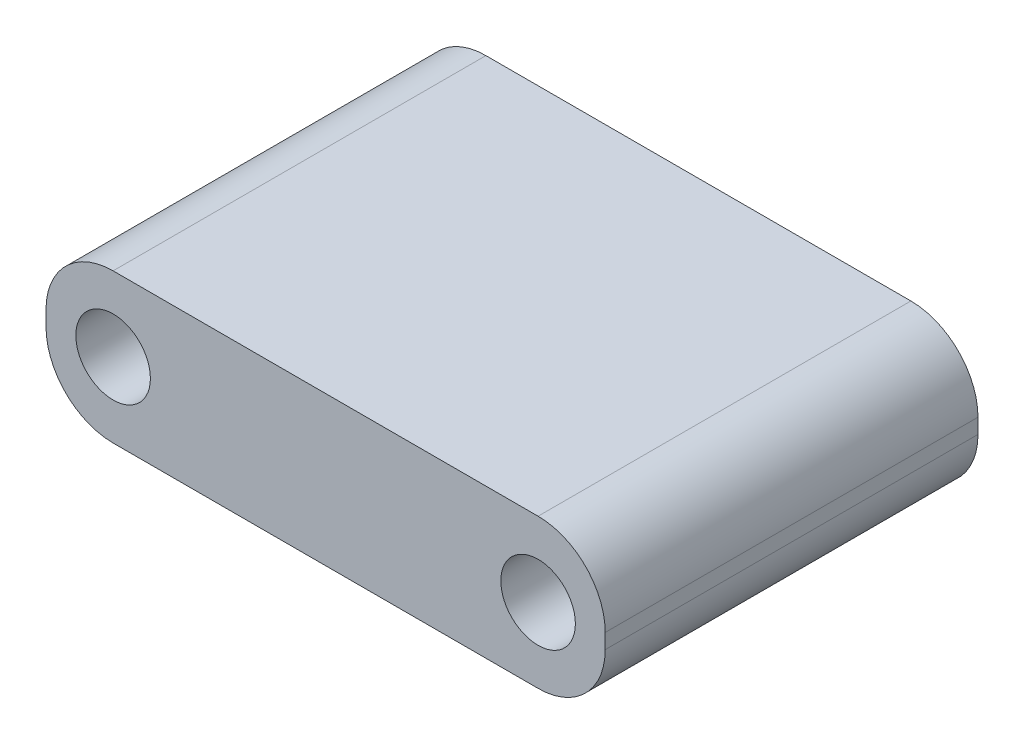
ISO-10303-21;
HEADER;
FILE_DESCRIPTION(('STEP AP214'),'2;1');
FILE_NAME('part.step','',(''),(''),'','','');
FILE_SCHEMA(('AUTOMOTIVE_DESIGN { 1 0 10303 214 1 1 1 1 }'));
ENDSEC;
DATA;
#1=APPLICATION_CONTEXT('core data for automotive mechanical design processes');
#2=APPLICATION_PROTOCOL_DEFINITION('international standard','automotive_design',2000,#1);
#3=PRODUCT_CONTEXT('',#1,'mechanical');
#4=PRODUCT('Part','Part','',(#3));
#5=PRODUCT_RELATED_PRODUCT_CATEGORY('part','',(#4));
#6=PRODUCT_DEFINITION_FORMATION('','',#4);
#7=PRODUCT_DEFINITION_CONTEXT('part definition',#1,'design');
#8=PRODUCT_DEFINITION('design','',#6,#7);
#9=PRODUCT_DEFINITION_SHAPE('','',#8);
#10=(LENGTH_UNIT() NAMED_UNIT(*) SI_UNIT(.MILLI.,.METRE.));
#11=(NAMED_UNIT(*) PLANE_ANGLE_UNIT() SI_UNIT($,.RADIAN.));
#12=(NAMED_UNIT(*) SI_UNIT($,.STERADIAN.) SOLID_ANGLE_UNIT());
#13=UNCERTAINTY_MEASURE_WITH_UNIT(LENGTH_MEASURE(1.E-05),#10,'distance_accuracy_value','');
#14=(GEOMETRIC_REPRESENTATION_CONTEXT(3) GLOBAL_UNCERTAINTY_ASSIGNED_CONTEXT((#13)) GLOBAL_UNIT_ASSIGNED_CONTEXT((#10,
#11,#12)) REPRESENTATION_CONTEXT('',''));
#15=CARTESIAN_POINT('',(0.,0.,0.));
#16=DIRECTION('',(0.,0.,1.));
#17=DIRECTION('',(1.,0.,0.));
#18=AXIS2_PLACEMENT_3D('',#15,#16,#17);
#19=CARTESIAN_POINT('',(-61.4373765867011,525.815636662687,10.));
#20=DIRECTION('',(0.,0.,1.));
#21=DIRECTION('',(1.,0.,0.));
#22=AXIS2_PLACEMENT_3D('',#19,#20,#21);
#23=PLANE('',#22);
#24=CARTESIAN_POINT('',(-61.4373765867011,525.615636662687,10.));
#25=DIRECTION('',(0.,0.,1.));
#26=DIRECTION('',(1.,0.,0.));
#27=AXIS2_PLACEMENT_3D('',#24,#25,#26);
#28=CIRCLE('',#27,0.999999999999998);
#29=CARTESIAN_POINT('',(-60.4373765867011,525.615636662687,10.));
#30=VERTEX_POINT('',#29);
#31=EDGE_CURVE('E134',#30,#30,#28,.T.);
#32=ORIENTED_EDGE('',*,*,#31,.F.);
#33=EDGE_LOOP('',(#32));
#34=FACE_BOUND('',#33,.T.);
#35=CARTESIAN_POINT('',(-61.4373765867011,525.815636662687,10.));
#36=DIRECTION('',(0.,0.,1.));
#37=DIRECTION('',(1.,0.,0.));
#38=AXIS2_PLACEMENT_3D('',#35,#36,#37);
#39=CIRCLE('',#38,1.80000000000001);
#40=CARTESIAN_POINT('',(-61.4373765867011,527.615636662687,10.));
#41=VERTEX_POINT('',#40);
#42=CARTESIAN_POINT('',(-63.2373765867011,525.815636662687,10.));
#43=VERTEX_POINT('',#42);
#44=EDGE_CURVE('E145',#41,#43,#39,.T.);
#45=ORIENTED_EDGE('',*,*,#44,.T.);
#46=DIRECTION('',(0.,-1.,0.));
#47=VECTOR('',#46,1.);
#48=CARTESIAN_POINT('',(-63.2373765867011,525.815636662687,10.));
#49=LINE('',#48,#47);
#50=CARTESIAN_POINT('',(-63.2373765867011,525.415636662687,10.));
#51=VERTEX_POINT('',#50);
#52=EDGE_CURVE('E93',#43,#51,#49,.T.);
#53=ORIENTED_EDGE('',*,*,#52,.T.);
#54=CARTESIAN_POINT('',(-61.4373765867011,525.415636662687,10.));
#55=DIRECTION('',(0.,0.,1.));
#56=DIRECTION('',(1.,0.,0.));
#57=AXIS2_PLACEMENT_3D('',#54,#55,#56);
#58=CIRCLE('',#57,1.80000000000001);
#59=CARTESIAN_POINT('',(-61.4373765867011,523.615636662687,10.));
#60=VERTEX_POINT('',#59);
#61=EDGE_CURVE('E160',#51,#60,#58,.T.);
#62=ORIENTED_EDGE('',*,*,#61,.T.);
#63=DIRECTION('',(1.,0.,0.));
#64=VECTOR('',#63,1.);
#65=CARTESIAN_POINT('',(-61.4373765867011,523.615636662687,10.));
#66=LINE('',#65,#64);
#67=CARTESIAN_POINT('',(-50.0373765867011,523.615636662687,10.));
#68=VERTEX_POINT('',#67);
#69=EDGE_CURVE('E173',#60,#68,#66,.T.);
#70=ORIENTED_EDGE('',*,*,#69,.T.);
#71=CARTESIAN_POINT('',(-50.0373765867011,525.415636662687,10.));
#72=DIRECTION('',(0.,0.,1.));
#73=DIRECTION('',(1.,0.,0.));
#74=AXIS2_PLACEMENT_3D('',#71,#72,#73);
#75=CIRCLE('',#74,1.80000000000001);
#76=CARTESIAN_POINT('',(-48.2373765867011,525.415636662687,10.));
#77=VERTEX_POINT('',#76);
#78=EDGE_CURVE('E112',#68,#77,#75,.T.);
#79=ORIENTED_EDGE('',*,*,#78,.T.);
#80=DIRECTION('',(0.,1.,0.));
#81=VECTOR('',#80,1.);
#82=CARTESIAN_POINT('',(-48.2373765867011,525.815636662687,10.));
#83=LINE('',#82,#81);
#84=CARTESIAN_POINT('',(-48.2373765867011,525.815636662687,10.));
#85=VERTEX_POINT('',#84);
#86=EDGE_CURVE('E106',#77,#85,#83,.T.);
#87=ORIENTED_EDGE('',*,*,#86,.T.);
#88=CARTESIAN_POINT('',(-50.0373765867011,525.815636662687,10.));
#89=DIRECTION('',(0.,0.,1.));
#90=DIRECTION('',(-1.,0.,0.));
#91=AXIS2_PLACEMENT_3D('',#88,#89,#90);
#92=CIRCLE('',#91,1.80000000000001);
#93=CARTESIAN_POINT('',(-50.0373765867011,527.615636662687,10.));
#94=VERTEX_POINT('',#93);
#95=EDGE_CURVE('E110',#85,#94,#92,.T.);
#96=ORIENTED_EDGE('',*,*,#95,.T.);
#97=DIRECTION('',(-1.,0.,0.));
#98=VECTOR('',#97,1.);
#99=CARTESIAN_POINT('',(-61.4373765867011,527.615636662687,10.));
#100=LINE('',#99,#98);
#101=EDGE_CURVE('E50',#94,#41,#100,.T.);
#102=ORIENTED_EDGE('',*,*,#101,.T.);
#103=EDGE_LOOP('',(#45,#53,#62,#70,#79,#87,#96,#102));
#104=FACE_BOUND('',#103,.T.);
#105=CARTESIAN_POINT('',(-50.0373765867011,525.615636662687,10.));
#106=DIRECTION('',(0.,0.,1.));
#107=DIRECTION('',(1.,0.,0.));
#108=AXIS2_PLACEMENT_3D('',#105,#106,#107);
#109=CIRCLE('',#108,0.999999999999998);
#110=CARTESIAN_POINT('',(-49.0373765867011,525.615636662687,10.));
#111=VERTEX_POINT('',#110);
#112=EDGE_CURVE('E182',#111,#111,#109,.T.);
#113=ORIENTED_EDGE('',*,*,#112,.F.);
#114=EDGE_LOOP('',(#113));
#115=FACE_BOUND('',#114,.T.);
#116=ADVANCED_FACE('F33',(#34,#104,#115),#23,.T.);
#117=CARTESIAN_POINT('',(-61.4373765867011,525.815636662687,0.));
#118=DIRECTION('',(0.,0.,1.));
#119=DIRECTION('',(1.,0.,0.));
#120=AXIS2_PLACEMENT_3D('',#117,#118,#119);
#121=PLANE('',#120);
#122=CARTESIAN_POINT('',(-61.4373765867011,525.815636662687,0.));
#123=DIRECTION('',(0.,0.,1.));
#124=DIRECTION('',(1.,0.,0.));
#125=AXIS2_PLACEMENT_3D('',#122,#123,#124);
#126=CIRCLE('',#125,1.80000000000001);
#127=CARTESIAN_POINT('',(-61.4373765867011,527.615636662687,0.));
#128=VERTEX_POINT('',#127);
#129=CARTESIAN_POINT('',(-63.2373765867011,525.815636662687,0.));
#130=VERTEX_POINT('',#129);
#131=EDGE_CURVE('E130',#128,#130,#126,.T.);
#132=ORIENTED_EDGE('',*,*,#131,.F.);
#133=DIRECTION('',(-1.,0.,0.));
#134=VECTOR('',#133,1.);
#135=CARTESIAN_POINT('',(-61.4373765867011,527.615636662687,0.));
#136=LINE('',#135,#134);
#137=CARTESIAN_POINT('',(-50.0373765867011,527.615636662687,0.));
#138=VERTEX_POINT('',#137);
#139=EDGE_CURVE('E85',#138,#128,#136,.T.);
#140=ORIENTED_EDGE('',*,*,#139,.F.);
#141=CARTESIAN_POINT('',(-50.0373765867011,525.815636662687,0.));
#142=DIRECTION('',(0.,0.,1.));
#143=DIRECTION('',(-1.,0.,0.));
#144=AXIS2_PLACEMENT_3D('',#141,#142,#143);
#145=CIRCLE('',#144,1.80000000000001);
#146=CARTESIAN_POINT('',(-48.2373765867011,525.815636662687,0.));
#147=VERTEX_POINT('',#146);
#148=EDGE_CURVE('E79',#147,#138,#145,.T.);
#149=ORIENTED_EDGE('',*,*,#148,.F.);
#150=DIRECTION('',(0.,1.,0.));
#151=VECTOR('',#150,1.);
#152=CARTESIAN_POINT('',(-48.2373765867011,525.815636662687,0.));
#153=LINE('',#152,#151);
#154=CARTESIAN_POINT('',(-48.2373765867011,525.415636662687,0.));
#155=VERTEX_POINT('',#154);
#156=EDGE_CURVE('E120',#155,#147,#153,.T.);
#157=ORIENTED_EDGE('',*,*,#156,.F.);
#158=CARTESIAN_POINT('',(-50.0373765867011,525.415636662687,0.));
#159=DIRECTION('',(0.,0.,1.));
#160=DIRECTION('',(1.,0.,0.));
#161=AXIS2_PLACEMENT_3D('',#158,#159,#160);
#162=CIRCLE('',#161,1.80000000000001);
#163=CARTESIAN_POINT('',(-50.0373765867011,523.615636662687,0.));
#164=VERTEX_POINT('',#163);
#165=EDGE_CURVE('E140',#164,#155,#162,.T.);
#166=ORIENTED_EDGE('',*,*,#165,.F.);
#167=DIRECTION('',(1.,0.,0.));
#168=VECTOR('',#167,1.);
#169=CARTESIAN_POINT('',(-61.4373765867011,523.615636662687,0.));
#170=LINE('',#169,#168);
#171=CARTESIAN_POINT('',(-61.4373765867011,523.615636662687,0.));
#172=VERTEX_POINT('',#171);
#173=EDGE_CURVE('E138',#172,#164,#170,.T.);
#174=ORIENTED_EDGE('',*,*,#173,.F.);
#175=CARTESIAN_POINT('',(-61.4373765867011,525.415636662687,0.));
#176=DIRECTION('',(0.,0.,1.));
#177=DIRECTION('',(1.,0.,0.));
#178=AXIS2_PLACEMENT_3D('',#175,#176,#177);
#179=CIRCLE('',#178,1.80000000000001);
#180=CARTESIAN_POINT('',(-63.2373765867011,525.415636662687,0.));
#181=VERTEX_POINT('',#180);
#182=EDGE_CURVE('E136',#181,#172,#179,.T.);
#183=ORIENTED_EDGE('',*,*,#182,.F.);
#184=DIRECTION('',(0.,-1.,0.));
#185=VECTOR('',#184,1.);
#186=CARTESIAN_POINT('',(-63.2373765867011,525.815636662687,0.));
#187=LINE('',#186,#185);
#188=EDGE_CURVE('E133',#130,#181,#187,.T.);
#189=ORIENTED_EDGE('',*,*,#188,.F.);
#190=EDGE_LOOP('',(#132,#140,#149,#157,#166,#174,#183,#189));
#191=FACE_BOUND('',#190,.T.);
#192=CARTESIAN_POINT('',(-61.4373765867011,525.615636662687,0.));
#193=DIRECTION('',(0.,0.,1.));
#194=DIRECTION('',(1.,0.,0.));
#195=AXIS2_PLACEMENT_3D('',#192,#193,#194);
#196=CIRCLE('',#195,0.999999999999998);
#197=CARTESIAN_POINT('',(-60.4373765867011,525.615636662687,0.));
#198=VERTEX_POINT('',#197);
#199=EDGE_CURVE('E179',#198,#198,#196,.T.);
#200=ORIENTED_EDGE('',*,*,#199,.T.);
#201=EDGE_LOOP('',(#200));
#202=FACE_BOUND('',#201,.T.);
#203=CARTESIAN_POINT('',(-50.0373765867011,525.615636662687,0.));
#204=DIRECTION('',(0.,0.,1.));
#205=DIRECTION('',(1.,0.,0.));
#206=AXIS2_PLACEMENT_3D('',#203,#204,#205);
#207=CIRCLE('',#206,0.999999999999998);
#208=CARTESIAN_POINT('',(-49.0373765867011,525.615636662687,0.));
#209=VERTEX_POINT('',#208);
#210=EDGE_CURVE('E185',#209,#209,#207,.T.);
#211=ORIENTED_EDGE('',*,*,#210,.T.);
#212=EDGE_LOOP('',(#211));
#213=FACE_BOUND('',#212,.T.);
#214=ADVANCED_FACE('F164',(#191,#202,#213),#121,.F.);
#215=CARTESIAN_POINT('',(-61.4373765867011,525.815636662687,10.));
#216=DIRECTION('',(0.,0.,-1.));
#217=DIRECTION('',(-1.,0.,0.));
#218=AXIS2_PLACEMENT_3D('',#215,#216,#217);
#219=CYLINDRICAL_SURFACE('',#218,1.80000000000001);
#220=ORIENTED_EDGE('',*,*,#131,.T.);
#221=DIRECTION('',(0.,0.,-1.));
#222=VECTOR('',#221,1.);
#223=CARTESIAN_POINT('',(-63.2373765867011,525.815636662687,10.));
#224=LINE('',#223,#222);
#225=EDGE_CURVE('E11',#43,#130,#224,.T.);
#226=ORIENTED_EDGE('',*,*,#225,.F.);
#227=ORIENTED_EDGE('',*,*,#44,.F.);
#228=DIRECTION('',(0.,0.,-1.));
#229=VECTOR('',#228,1.);
#230=CARTESIAN_POINT('',(-61.4373765867011,527.615636662687,10.));
#231=LINE('',#230,#229);
#232=EDGE_CURVE('E126',#41,#128,#231,.T.);
#233=ORIENTED_EDGE('',*,*,#232,.T.);
#234=EDGE_LOOP('',(#220,#226,#227,#233));
#235=FACE_BOUND('',#234,.T.);
#236=ADVANCED_FACE('F35',(#235),#219,.T.);
#237=CARTESIAN_POINT('',(-63.2373765867011,525.815636662687,10.));
#238=DIRECTION('',(1.,0.,0.));
#239=DIRECTION('',(0.,0.,-1.));
#240=AXIS2_PLACEMENT_3D('',#237,#238,#239);
#241=PLANE('',#240);
#242=ORIENTED_EDGE('',*,*,#188,.T.);
#243=DIRECTION('',(0.,0.,-1.));
#244=VECTOR('',#243,1.);
#245=CARTESIAN_POINT('',(-63.2373765867011,525.415636662687,10.));
#246=LINE('',#245,#244);
#247=EDGE_CURVE('E42',#51,#181,#246,.T.);
#248=ORIENTED_EDGE('',*,*,#247,.F.);
#249=ORIENTED_EDGE('',*,*,#52,.F.);
#250=ORIENTED_EDGE('',*,*,#225,.T.);
#251=EDGE_LOOP('',(#242,#248,#249,#250));
#252=FACE_BOUND('',#251,.T.);
#253=ADVANCED_FACE('F217',(#252),#241,.F.);
#254=CARTESIAN_POINT('',(-61.4373765867011,525.415636662687,10.));
#255=DIRECTION('',(0.,0.,-1.));
#256=DIRECTION('',(-1.,0.,0.));
#257=AXIS2_PLACEMENT_3D('',#254,#255,#256);
#258=CYLINDRICAL_SURFACE('',#257,1.80000000000001);
#259=ORIENTED_EDGE('',*,*,#182,.T.);
#260=DIRECTION('',(0.,0.,-1.));
#261=VECTOR('',#260,1.);
#262=CARTESIAN_POINT('',(-61.4373765867011,523.615636662687,10.));
#263=LINE('',#262,#261);
#264=EDGE_CURVE('E152',#60,#172,#263,.T.);
#265=ORIENTED_EDGE('',*,*,#264,.F.);
#266=ORIENTED_EDGE('',*,*,#61,.F.);
#267=ORIENTED_EDGE('',*,*,#247,.T.);
#268=EDGE_LOOP('',(#259,#265,#266,#267));
#269=FACE_BOUND('',#268,.T.);
#270=ADVANCED_FACE('F158',(#269),#258,.T.);
#271=CARTESIAN_POINT('',(-61.4373765867011,523.615636662687,10.));
#272=DIRECTION('',(0.,1.,0.));
#273=DIRECTION('',(0.,0.,1.));
#274=AXIS2_PLACEMENT_3D('',#271,#272,#273);
#275=PLANE('',#274);
#276=ORIENTED_EDGE('',*,*,#173,.T.);
#277=DIRECTION('',(0.,0.,-1.));
#278=VECTOR('',#277,1.);
#279=CARTESIAN_POINT('',(-50.0373765867011,523.615636662687,10.));
#280=LINE('',#279,#278);
#281=EDGE_CURVE('E149',#68,#164,#280,.T.);
#282=ORIENTED_EDGE('',*,*,#281,.F.);
#283=ORIENTED_EDGE('',*,*,#69,.F.);
#284=ORIENTED_EDGE('',*,*,#264,.T.);
#285=EDGE_LOOP('',(#276,#282,#283,#284));
#286=FACE_BOUND('',#285,.T.);
#287=ADVANCED_FACE('F169',(#286),#275,.F.);
#288=CARTESIAN_POINT('',(-50.0373765867011,525.415636662687,10.));
#289=DIRECTION('',(0.,0.,-1.));
#290=DIRECTION('',(-1.,0.,0.));
#291=AXIS2_PLACEMENT_3D('',#288,#289,#290);
#292=CYLINDRICAL_SURFACE('',#291,1.80000000000001);
#293=ORIENTED_EDGE('',*,*,#165,.T.);
#294=DIRECTION('',(0.,0.,-1.));
#295=VECTOR('',#294,1.);
#296=CARTESIAN_POINT('',(-48.2373765867011,525.415636662687,10.));
#297=LINE('',#296,#295);
#298=EDGE_CURVE('E121',#77,#155,#297,.T.);
#299=ORIENTED_EDGE('',*,*,#298,.F.);
#300=ORIENTED_EDGE('',*,*,#78,.F.);
#301=ORIENTED_EDGE('',*,*,#281,.T.);
#302=EDGE_LOOP('',(#293,#299,#300,#301));
#303=FACE_BOUND('',#302,.T.);
#304=ADVANCED_FACE('F172',(#303),#292,.T.);
#305=CARTESIAN_POINT('',(-48.2373765867011,525.815636662687,10.));
#306=DIRECTION('',(-1.,0.,0.));
#307=DIRECTION('',(0.,0.,1.));
#308=AXIS2_PLACEMENT_3D('',#305,#306,#307);
#309=PLANE('',#308);
#310=ORIENTED_EDGE('',*,*,#156,.T.);
#311=DIRECTION('',(0.,0.,-1.));
#312=VECTOR('',#311,1.);
#313=CARTESIAN_POINT('',(-48.2373765867011,525.815636662687,10.));
#314=LINE('',#313,#312);
#315=EDGE_CURVE('E117',#85,#147,#314,.T.);
#316=ORIENTED_EDGE('',*,*,#315,.F.);
#317=ORIENTED_EDGE('',*,*,#86,.F.);
#318=ORIENTED_EDGE('',*,*,#298,.T.);
#319=EDGE_LOOP('',(#310,#316,#317,#318));
#320=FACE_BOUND('',#319,.T.);
#321=ADVANCED_FACE('F118',(#320),#309,.F.);
#322=CARTESIAN_POINT('',(-50.0373765867011,525.815636662687,10.));
#323=DIRECTION('',(0.,0.,-1.));
#324=DIRECTION('',(-1.,0.,0.));
#325=AXIS2_PLACEMENT_3D('',#322,#323,#324);
#326=CYLINDRICAL_SURFACE('',#325,1.80000000000001);
#327=ORIENTED_EDGE('',*,*,#148,.T.);
#328=DIRECTION('',(0.,0.,-1.));
#329=VECTOR('',#328,1.);
#330=CARTESIAN_POINT('',(-50.0373765867011,527.615636662687,10.));
#331=LINE('',#330,#329);
#332=EDGE_CURVE('E122',#94,#138,#331,.T.);
#333=ORIENTED_EDGE('',*,*,#332,.F.);
#334=ORIENTED_EDGE('',*,*,#95,.F.);
#335=ORIENTED_EDGE('',*,*,#315,.T.);
#336=EDGE_LOOP('',(#327,#333,#334,#335));
#337=FACE_BOUND('',#336,.T.);
#338=ADVANCED_FACE('F124',(#337),#326,.T.);
#339=CARTESIAN_POINT('',(-61.4373765867011,527.615636662687,10.));
#340=DIRECTION('',(0.,-1.,0.));
#341=DIRECTION('',(0.,0.,-1.));
#342=AXIS2_PLACEMENT_3D('',#339,#340,#341);
#343=PLANE('',#342);
#344=ORIENTED_EDGE('',*,*,#139,.T.);
#345=ORIENTED_EDGE('',*,*,#232,.F.);
#346=ORIENTED_EDGE('',*,*,#101,.F.);
#347=ORIENTED_EDGE('',*,*,#332,.T.);
#348=EDGE_LOOP('',(#344,#345,#346,#347));
#349=FACE_BOUND('',#348,.T.);
#350=ADVANCED_FACE('F205',(#349),#343,.F.);
#351=CARTESIAN_POINT('',(-61.4373765867011,525.615636662687,10.));
#352=DIRECTION('',(0.,0.,-1.));
#353=DIRECTION('',(-1.,0.,0.));
#354=AXIS2_PLACEMENT_3D('',#351,#352,#353);
#355=CYLINDRICAL_SURFACE('',#354,0.999999999999998);
#356=ORIENTED_EDGE('',*,*,#31,.T.);
#357=EDGE_LOOP('',(#356));
#358=FACE_BOUND('',#357,.T.);
#359=ORIENTED_EDGE('',*,*,#199,.F.);
#360=EDGE_LOOP('',(#359));
#361=FACE_BOUND('',#360,.T.);
#362=ADVANCED_FACE('F202',(#358,#361),#355,.F.);
#363=CARTESIAN_POINT('',(-50.0373765867011,525.615636662687,10.));
#364=DIRECTION('',(0.,0.,-1.));
#365=DIRECTION('',(-1.,0.,0.));
#366=AXIS2_PLACEMENT_3D('',#363,#364,#365);
#367=CYLINDRICAL_SURFACE('',#366,0.999999999999998);
#368=ORIENTED_EDGE('',*,*,#112,.T.);
#369=EDGE_LOOP('',(#368));
#370=FACE_BOUND('',#369,.T.);
#371=ORIENTED_EDGE('',*,*,#210,.F.);
#372=EDGE_LOOP('',(#371));
#373=FACE_BOUND('',#372,.T.);
#374=ADVANCED_FACE('F191',(#370,#373),#367,.F.);
#375=CLOSED_SHELL('',(#116,#214,#236,#253,#270,#287,#304,#321,#338,#350,#362,#374));
#376=MANIFOLD_SOLID_BREP('B2',#375);
#377=ADVANCED_BREP_SHAPE_REPRESENTATION('',(#18,#376),#14);
#378=SHAPE_DEFINITION_REPRESENTATION(#9,#377);
ENDSEC;
END-ISO-10303-21;
